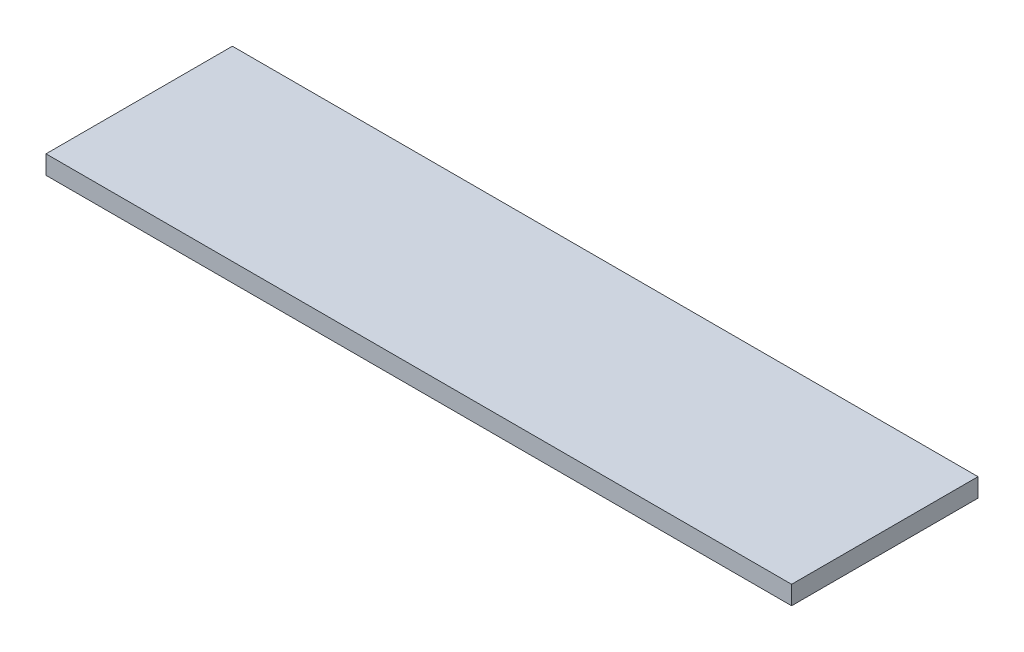
ISO-10303-21;
HEADER;
FILE_DESCRIPTION(('STEP AP214'),'2;1');
FILE_NAME('part.step','',(''),(''),'','','');
FILE_SCHEMA(('AUTOMOTIVE_DESIGN { 1 0 10303 214 1 1 1 1 }'));
ENDSEC;
DATA;
#1=APPLICATION_CONTEXT('core data for automotive mechanical design processes');
#2=APPLICATION_PROTOCOL_DEFINITION('international standard','automotive_design',2000,#1);
#3=PRODUCT_CONTEXT('',#1,'mechanical');
#4=PRODUCT('Part','Part','',(#3));
#5=PRODUCT_RELATED_PRODUCT_CATEGORY('part','',(#4));
#6=PRODUCT_DEFINITION_FORMATION('','',#4);
#7=PRODUCT_DEFINITION_CONTEXT('part definition',#1,'design');
#8=PRODUCT_DEFINITION('design','',#6,#7);
#9=PRODUCT_DEFINITION_SHAPE('','',#8);
#10=(LENGTH_UNIT() NAMED_UNIT(*) SI_UNIT(.MILLI.,.METRE.));
#11=(NAMED_UNIT(*) PLANE_ANGLE_UNIT() SI_UNIT($,.RADIAN.));
#12=(NAMED_UNIT(*) SI_UNIT($,.STERADIAN.) SOLID_ANGLE_UNIT());
#13=UNCERTAINTY_MEASURE_WITH_UNIT(LENGTH_MEASURE(1.E-05),#10,'distance_accuracy_value','');
#14=(GEOMETRIC_REPRESENTATION_CONTEXT(3) GLOBAL_UNCERTAINTY_ASSIGNED_CONTEXT((#13)) GLOBAL_UNIT_ASSIGNED_CONTEXT((#10,
#11,#12)) REPRESENTATION_CONTEXT('',''));
#15=CARTESIAN_POINT('',(0.,0.,0.));
#16=DIRECTION('',(0.,0.,1.));
#17=DIRECTION('',(1.,0.,0.));
#18=AXIS2_PLACEMENT_3D('',#15,#16,#17);
#19=CARTESIAN_POINT('',(-60.,3.,15.));
#20=DIRECTION('',(1.,0.,0.));
#21=DIRECTION('',(0.,0.,-1.));
#22=AXIS2_PLACEMENT_3D('',#19,#20,#21);
#23=PLANE('',#22);
#24=DIRECTION('',(0.,0.,1.));
#25=VECTOR('',#24,1.);
#26=CARTESIAN_POINT('',(-60.,0.,15.));
#27=LINE('',#26,#25);
#28=CARTESIAN_POINT('',(-60.,0.,-15.));
#29=VERTEX_POINT('',#28);
#30=CARTESIAN_POINT('',(-60.,0.,15.));
#31=VERTEX_POINT('',#30);
#32=EDGE_CURVE('E113',#29,#31,#27,.T.);
#33=ORIENTED_EDGE('',*,*,#32,.T.);
#34=DIRECTION('',(0.,-1.,0.));
#35=VECTOR('',#34,1.);
#36=CARTESIAN_POINT('',(-60.,3.,15.));
#37=LINE('',#36,#35);
#38=CARTESIAN_POINT('',(-60.,3.,15.));
#39=VERTEX_POINT('',#38);
#40=EDGE_CURVE('E11',#39,#31,#37,.T.);
#41=ORIENTED_EDGE('',*,*,#40,.F.);
#42=DIRECTION('',(0.,0.,1.));
#43=VECTOR('',#42,1.);
#44=CARTESIAN_POINT('',(-60.,3.,15.));
#45=LINE('',#44,#43);
#46=CARTESIAN_POINT('',(-60.,3.,-15.));
#47=VERTEX_POINT('',#46);
#48=EDGE_CURVE('E97',#47,#39,#45,.T.);
#49=ORIENTED_EDGE('',*,*,#48,.F.);
#50=DIRECTION('',(0.,-1.,0.));
#51=VECTOR('',#50,1.);
#52=CARTESIAN_POINT('',(-60.,3.,-15.));
#53=LINE('',#52,#51);
#54=EDGE_CURVE('E109',#47,#29,#53,.T.);
#55=ORIENTED_EDGE('',*,*,#54,.T.);
#56=EDGE_LOOP('',(#33,#41,#49,#55));
#57=FACE_BOUND('',#56,.T.);
#58=ADVANCED_FACE('F45',(#57),#23,.F.);
#59=CARTESIAN_POINT('',(60.,3.,15.));
#60=DIRECTION('',(0.,0.,-1.));
#61=DIRECTION('',(-1.,0.,0.));
#62=AXIS2_PLACEMENT_3D('',#59,#60,#61);
#63=PLANE('',#62);
#64=DIRECTION('',(1.,0.,0.));
#65=VECTOR('',#64,1.);
#66=CARTESIAN_POINT('',(60.,0.,15.));
#67=LINE('',#66,#65);
#68=CARTESIAN_POINT('',(60.,0.,15.));
#69=VERTEX_POINT('',#68);
#70=EDGE_CURVE('E102',#31,#69,#67,.T.);
#71=ORIENTED_EDGE('',*,*,#70,.T.);
#72=DIRECTION('',(0.,-1.,0.));
#73=VECTOR('',#72,1.);
#74=CARTESIAN_POINT('',(60.,3.,15.));
#75=LINE('',#74,#73);
#76=CARTESIAN_POINT('',(60.,3.,15.));
#77=VERTEX_POINT('',#76);
#78=EDGE_CURVE('E54',#77,#69,#75,.T.);
#79=ORIENTED_EDGE('',*,*,#78,.F.);
#80=DIRECTION('',(1.,0.,0.));
#81=VECTOR('',#80,1.);
#82=CARTESIAN_POINT('',(60.,3.,15.));
#83=LINE('',#82,#81);
#84=EDGE_CURVE('E92',#39,#77,#83,.T.);
#85=ORIENTED_EDGE('',*,*,#84,.F.);
#86=ORIENTED_EDGE('',*,*,#40,.T.);
#87=EDGE_LOOP('',(#71,#79,#85,#86));
#88=FACE_BOUND('',#87,.T.);
#89=ADVANCED_FACE('F101',(#88),#63,.F.);
#90=CARTESIAN_POINT('',(60.,3.,15.));
#91=DIRECTION('',(-1.,0.,0.));
#92=DIRECTION('',(0.,0.,1.));
#93=AXIS2_PLACEMENT_3D('',#90,#91,#92);
#94=PLANE('',#93);
#95=DIRECTION('',(0.,0.,-1.));
#96=VECTOR('',#95,1.);
#97=CARTESIAN_POINT('',(60.,0.,15.));
#98=LINE('',#97,#96);
#99=CARTESIAN_POINT('',(60.,0.,-15.));
#100=VERTEX_POINT('',#99);
#101=EDGE_CURVE('E79',#69,#100,#98,.T.);
#102=ORIENTED_EDGE('',*,*,#101,.T.);
#103=DIRECTION('',(0.,-1.,0.));
#104=VECTOR('',#103,1.);
#105=CARTESIAN_POINT('',(60.,3.,-15.));
#106=LINE('',#105,#104);
#107=CARTESIAN_POINT('',(60.,3.,-15.));
#108=VERTEX_POINT('',#107);
#109=EDGE_CURVE('E104',#108,#100,#106,.T.);
#110=ORIENTED_EDGE('',*,*,#109,.F.);
#111=DIRECTION('',(0.,0.,-1.));
#112=VECTOR('',#111,1.);
#113=CARTESIAN_POINT('',(60.,3.,15.));
#114=LINE('',#113,#112);
#115=EDGE_CURVE('E95',#77,#108,#114,.T.);
#116=ORIENTED_EDGE('',*,*,#115,.F.);
#117=ORIENTED_EDGE('',*,*,#78,.T.);
#118=EDGE_LOOP('',(#102,#110,#116,#117));
#119=FACE_BOUND('',#118,.T.);
#120=ADVANCED_FACE('F105',(#119),#94,.F.);
#121=CARTESIAN_POINT('',(60.,3.,-15.));
#122=DIRECTION('',(0.,0.,1.));
#123=DIRECTION('',(1.,0.,0.));
#124=AXIS2_PLACEMENT_3D('',#121,#122,#123);
#125=PLANE('',#124);
#126=DIRECTION('',(-1.,0.,0.));
#127=VECTOR('',#126,1.);
#128=CARTESIAN_POINT('',(60.,0.,-15.));
#129=LINE('',#128,#127);
#130=EDGE_CURVE('E85',#100,#29,#129,.T.);
#131=ORIENTED_EDGE('',*,*,#130,.T.);
#132=ORIENTED_EDGE('',*,*,#54,.F.);
#133=DIRECTION('',(-1.,0.,0.));
#134=VECTOR('',#133,1.);
#135=CARTESIAN_POINT('',(60.,3.,-15.));
#136=LINE('',#135,#134);
#137=EDGE_CURVE('E62',#108,#47,#136,.T.);
#138=ORIENTED_EDGE('',*,*,#137,.F.);
#139=ORIENTED_EDGE('',*,*,#109,.T.);
#140=EDGE_LOOP('',(#131,#132,#138,#139));
#141=FACE_BOUND('',#140,.T.);
#142=ADVANCED_FACE('F126',(#141),#125,.F.);
#143=CARTESIAN_POINT('',(0.,3.,0.));
#144=DIRECTION('',(0.,1.,0.));
#145=DIRECTION('',(0.,0.,1.));
#146=AXIS2_PLACEMENT_3D('',#143,#144,#145);
#147=PLANE('',#146);
#148=ORIENTED_EDGE('',*,*,#48,.T.);
#149=ORIENTED_EDGE('',*,*,#84,.T.);
#150=ORIENTED_EDGE('',*,*,#115,.T.);
#151=ORIENTED_EDGE('',*,*,#137,.T.);
#152=EDGE_LOOP('',(#148,#149,#150,#151));
#153=FACE_BOUND('',#152,.T.);
#154=ADVANCED_FACE('F93',(#153),#147,.T.);
#155=CARTESIAN_POINT('',(0.,0.,0.));
#156=DIRECTION('',(0.,1.,0.));
#157=DIRECTION('',(0.,0.,1.));
#158=AXIS2_PLACEMENT_3D('',#155,#156,#157);
#159=PLANE('',#158);
#160=ORIENTED_EDGE('',*,*,#32,.F.);
#161=ORIENTED_EDGE('',*,*,#130,.F.);
#162=ORIENTED_EDGE('',*,*,#101,.F.);
#163=ORIENTED_EDGE('',*,*,#70,.F.);
#164=EDGE_LOOP('',(#160,#161,#162,#163));
#165=FACE_BOUND('',#164,.T.);
#166=ADVANCED_FACE('F129',(#165),#159,.F.);
#167=CLOSED_SHELL('',(#58,#89,#120,#142,#154,#166));
#168=MANIFOLD_SOLID_BREP('B2',#167);
#169=ADVANCED_BREP_SHAPE_REPRESENTATION('',(#18,#168),#14);
#170=SHAPE_DEFINITION_REPRESENTATION(#9,#169);
ENDSEC;
END-ISO-10303-21;
